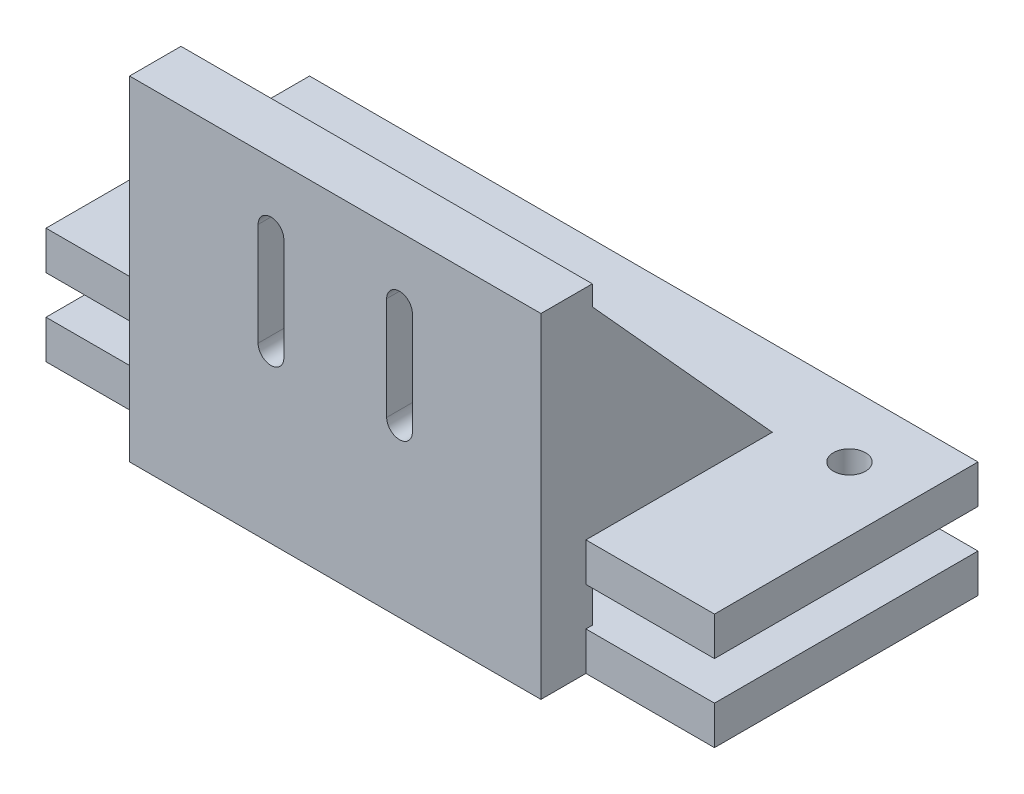
ISO-10303-21;
HEADER;
FILE_DESCRIPTION(('STEP AP214'),'2;1');
FILE_NAME('part.step','',(''),(''),'','','');
FILE_SCHEMA(('AUTOMOTIVE_DESIGN { 1 0 10303 214 1 1 1 1 }'));
ENDSEC;
DATA;
#1=APPLICATION_CONTEXT('core data for automotive mechanical design processes');
#2=APPLICATION_PROTOCOL_DEFINITION('international standard','automotive_design',2000,#1);
#3=PRODUCT_CONTEXT('',#1,'mechanical');
#4=PRODUCT('Part','Part','',(#3));
#5=PRODUCT_RELATED_PRODUCT_CATEGORY('part','',(#4));
#6=PRODUCT_DEFINITION_FORMATION('','',#4);
#7=PRODUCT_DEFINITION_CONTEXT('part definition',#1,'design');
#8=PRODUCT_DEFINITION('design','',#6,#7);
#9=PRODUCT_DEFINITION_SHAPE('','',#8);
#10=(LENGTH_UNIT() NAMED_UNIT(*) SI_UNIT(.MILLI.,.METRE.));
#11=(NAMED_UNIT(*) PLANE_ANGLE_UNIT() SI_UNIT($,.RADIAN.));
#12=(NAMED_UNIT(*) SI_UNIT($,.STERADIAN.) SOLID_ANGLE_UNIT());
#13=UNCERTAINTY_MEASURE_WITH_UNIT(LENGTH_MEASURE(1.E-05),#10,'distance_accuracy_value','');
#14=(GEOMETRIC_REPRESENTATION_CONTEXT(3) GLOBAL_UNCERTAINTY_ASSIGNED_CONTEXT((#13)) GLOBAL_UNIT_ASSIGNED_CONTEXT((#10,
#11,#12)) REPRESENTATION_CONTEXT('',''));
#15=CARTESIAN_POINT('',(0.,0.,0.));
#16=DIRECTION('',(0.,0.,1.));
#17=DIRECTION('',(1.,0.,0.));
#18=AXIS2_PLACEMENT_3D('',#15,#16,#17);
#19=CARTESIAN_POINT('',(0.,0.,0.));
#20=DIRECTION('',(0.,0.,-1.));
#21=DIRECTION('',(-1.,0.,0.));
#22=AXIS2_PLACEMENT_3D('',#19,#20,#21);
#23=PLANE('',#22);
#24=DIRECTION('',(0.,1.,0.));
#25=VECTOR('',#24,1.);
#26=CARTESIAN_POINT('',(32.,-11.5,0.));
#27=LINE('',#26,#25);
#28=CARTESIAN_POINT('',(32.,37.3965517241379,0.));
#29=VERTEX_POINT('',#28);
#30=CARTESIAN_POINT('',(32.,40.5,0.));
#31=VERTEX_POINT('',#30);
#32=EDGE_CURVE('E419',#29,#31,#27,.T.);
#33=ORIENTED_EDGE('',*,*,#32,.F.);
#34=DIRECTION('',(-1.,0.,0.));
#35=VECTOR('',#34,1.);
#36=CARTESIAN_POINT('',(0.,37.3965517241379,0.));
#37=LINE('',#36,#35);
#38=CARTESIAN_POINT('',(26.,37.3965517241379,0.));
#39=VERTEX_POINT('',#38);
#40=EDGE_CURVE('E314',#29,#39,#37,.T.);
#41=ORIENTED_EDGE('',*,*,#40,.T.);
#42=DIRECTION('',(0.,1.,0.));
#43=VECTOR('',#42,1.);
#44=CARTESIAN_POINT('',(26.,0.,0.));
#45=LINE('',#44,#43);
#46=CARTESIAN_POINT('',(26.,6.5,0.));
#47=VERTEX_POINT('',#46);
#48=EDGE_CURVE('E317',#47,#39,#45,.T.);
#49=ORIENTED_EDGE('',*,*,#48,.F.);
#50=DIRECTION('',(-1.,0.,0.));
#51=VECTOR('',#50,1.);
#52=CARTESIAN_POINT('',(0.,6.5,0.));
#53=LINE('',#52,#51);
#54=CARTESIAN_POINT('',(-26.,6.5,0.));
#55=VERTEX_POINT('',#54);
#56=EDGE_CURVE('E456',#47,#55,#53,.T.);
#57=ORIENTED_EDGE('',*,*,#56,.T.);
#58=DIRECTION('',(0.,1.,0.));
#59=VECTOR('',#58,1.);
#60=CARTESIAN_POINT('',(-26.,0.,0.));
#61=LINE('',#60,#59);
#62=CARTESIAN_POINT('',(-26.,37.3965517241379,0.));
#63=VERTEX_POINT('',#62);
#64=EDGE_CURVE('E327',#55,#63,#61,.T.);
#65=ORIENTED_EDGE('',*,*,#64,.T.);
#66=DIRECTION('',(-1.,0.,0.));
#67=VECTOR('',#66,1.);
#68=CARTESIAN_POINT('',(0.,37.3965517241379,0.));
#69=LINE('',#68,#67);
#70=CARTESIAN_POINT('',(-32.,37.3965517241379,0.));
#71=VERTEX_POINT('',#70);
#72=EDGE_CURVE('E330',#63,#71,#69,.T.);
#73=ORIENTED_EDGE('',*,*,#72,.T.);
#74=DIRECTION('',(0.,-1.,0.));
#75=VECTOR('',#74,1.);
#76=CARTESIAN_POINT('',(-32.,-11.5,0.));
#77=LINE('',#76,#75);
#78=CARTESIAN_POINT('',(-32.,40.5,0.));
#79=VERTEX_POINT('',#78);
#80=EDGE_CURVE('E424',#79,#71,#77,.T.);
#81=ORIENTED_EDGE('',*,*,#80,.F.);
#82=DIRECTION('',(-1.,0.,0.));
#83=VECTOR('',#82,1.);
#84=CARTESIAN_POINT('',(-32.,40.5,0.));
#85=LINE('',#84,#83);
#86=EDGE_CURVE('E434',#31,#79,#85,.T.);
#87=ORIENTED_EDGE('',*,*,#86,.F.);
#88=EDGE_LOOP('',(#33,#41,#49,#57,#65,#73,#81,#87));
#89=FACE_BOUND('',#88,.T.);
#90=DIRECTION('',(0.,-1.,0.));
#91=VECTOR('',#90,1.);
#92=CARTESIAN_POINT('',(8.,30.5,0.));
#93=LINE('',#92,#91);
#94=CARTESIAN_POINT('',(8.,30.5,0.));
#95=VERTEX_POINT('',#94);
#96=CARTESIAN_POINT('',(8.,14.5,0.));
#97=VERTEX_POINT('',#96);
#98=EDGE_CURVE('E279',#95,#97,#93,.T.);
#99=ORIENTED_EDGE('',*,*,#98,.T.);
#100=CARTESIAN_POINT('',(10.,14.5,0.));
#101=DIRECTION('',(0.,0.,1.));
#102=DIRECTION('',(1.,0.,0.));
#103=AXIS2_PLACEMENT_3D('',#100,#101,#102);
#104=CIRCLE('',#103,2.);
#105=CARTESIAN_POINT('',(12.,14.5,0.));
#106=VERTEX_POINT('',#105);
#107=EDGE_CURVE('E60',#97,#106,#104,.T.);
#108=ORIENTED_EDGE('',*,*,#107,.T.);
#109=DIRECTION('',(0.,1.,0.));
#110=VECTOR('',#109,1.);
#111=CARTESIAN_POINT('',(12.,14.5,0.));
#112=LINE('',#111,#110);
#113=CARTESIAN_POINT('',(12.,30.5,0.));
#114=VERTEX_POINT('',#113);
#115=EDGE_CURVE('E288',#106,#114,#112,.T.);
#116=ORIENTED_EDGE('',*,*,#115,.T.);
#117=CARTESIAN_POINT('',(10.,30.5,0.));
#118=DIRECTION('',(0.,0.,1.));
#119=DIRECTION('',(1.,0.,0.));
#120=AXIS2_PLACEMENT_3D('',#117,#118,#119);
#121=CIRCLE('',#120,2.);
#122=EDGE_CURVE('E292',#114,#95,#121,.T.);
#123=ORIENTED_EDGE('',*,*,#122,.T.);
#124=EDGE_LOOP('',(#99,#108,#116,#123));
#125=FACE_BOUND('',#124,.T.);
#126=DIRECTION('',(0.,-1.,0.));
#127=VECTOR('',#126,1.);
#128=CARTESIAN_POINT('',(-12.,30.5,0.));
#129=LINE('',#128,#127);
#130=CARTESIAN_POINT('',(-12.,30.5,0.));
#131=VERTEX_POINT('',#130);
#132=CARTESIAN_POINT('',(-12.,14.5,0.));
#133=VERTEX_POINT('',#132);
#134=EDGE_CURVE('E244',#131,#133,#129,.T.);
#135=ORIENTED_EDGE('',*,*,#134,.T.);
#136=CARTESIAN_POINT('',(-10.,14.5,0.));
#137=DIRECTION('',(0.,0.,1.));
#138=DIRECTION('',(1.,0.,0.));
#139=AXIS2_PLACEMENT_3D('',#136,#137,#138);
#140=CIRCLE('',#139,2.);
#141=CARTESIAN_POINT('',(-8.,14.5,0.));
#142=VERTEX_POINT('',#141);
#143=EDGE_CURVE('E52',#133,#142,#140,.T.);
#144=ORIENTED_EDGE('',*,*,#143,.T.);
#145=DIRECTION('',(0.,1.,0.));
#146=VECTOR('',#145,1.);
#147=CARTESIAN_POINT('',(-8.,14.5,0.));
#148=LINE('',#147,#146);
#149=CARTESIAN_POINT('',(-8.,30.5,0.));
#150=VERTEX_POINT('',#149);
#151=EDGE_CURVE('E250',#142,#150,#148,.T.);
#152=ORIENTED_EDGE('',*,*,#151,.T.);
#153=CARTESIAN_POINT('',(-10.,30.5,0.));
#154=DIRECTION('',(0.,0.,1.));
#155=DIRECTION('',(1.,0.,0.));
#156=AXIS2_PLACEMENT_3D('',#153,#154,#155);
#157=CIRCLE('',#156,2.);
#158=EDGE_CURVE('E267',#150,#131,#157,.T.);
#159=ORIENTED_EDGE('',*,*,#158,.T.);
#160=EDGE_LOOP('',(#135,#144,#152,#159));
#161=FACE_BOUND('',#160,.T.);
#162=ADVANCED_FACE('F35',(#89,#125,#161),#23,.T.);
#163=CARTESIAN_POINT('',(0.,0.,8.));
#164=DIRECTION('',(0.,0.,-1.));
#165=DIRECTION('',(-1.,0.,0.));
#166=AXIS2_PLACEMENT_3D('',#163,#164,#165);
#167=PLANE('',#166);
#168=CARTESIAN_POINT('',(10.,14.5,8.));
#169=DIRECTION('',(0.,0.,1.));
#170=DIRECTION('',(1.,0.,0.));
#171=AXIS2_PLACEMENT_3D('',#168,#169,#170);
#172=CIRCLE('',#171,2.);
#173=CARTESIAN_POINT('',(8.,14.5,8.));
#174=VERTEX_POINT('',#173);
#175=CARTESIAN_POINT('',(12.,14.5,8.));
#176=VERTEX_POINT('',#175);
#177=EDGE_CURVE('E276',#174,#176,#172,.T.);
#178=ORIENTED_EDGE('',*,*,#177,.F.);
#179=DIRECTION('',(0.,-1.,0.));
#180=VECTOR('',#179,1.);
#181=CARTESIAN_POINT('',(8.,30.5,8.));
#182=LINE('',#181,#180);
#183=CARTESIAN_POINT('',(8.,30.5,8.));
#184=VERTEX_POINT('',#183);
#185=EDGE_CURVE('E284',#184,#174,#182,.T.);
#186=ORIENTED_EDGE('',*,*,#185,.F.);
#187=CARTESIAN_POINT('',(10.,30.5,8.));
#188=DIRECTION('',(0.,0.,1.));
#189=DIRECTION('',(1.,0.,0.));
#190=AXIS2_PLACEMENT_3D('',#187,#188,#189);
#191=CIRCLE('',#190,2.);
#192=CARTESIAN_POINT('',(12.,30.5,8.));
#193=VERTEX_POINT('',#192);
#194=EDGE_CURVE('E281',#193,#184,#191,.T.);
#195=ORIENTED_EDGE('',*,*,#194,.F.);
#196=DIRECTION('',(0.,1.,0.));
#197=VECTOR('',#196,1.);
#198=CARTESIAN_POINT('',(12.,14.5,8.));
#199=LINE('',#198,#197);
#200=EDGE_CURVE('E278',#176,#193,#199,.T.);
#201=ORIENTED_EDGE('',*,*,#200,.F.);
#202=EDGE_LOOP('',(#178,#186,#195,#201));
#203=FACE_BOUND('',#202,.T.);
#204=DIRECTION('',(0.,1.,0.));
#205=VECTOR('',#204,1.);
#206=CARTESIAN_POINT('',(32.,-11.5,8.));
#207=LINE('',#206,#205);
#208=CARTESIAN_POINT('',(32.,-11.5,8.));
#209=VERTEX_POINT('',#208);
#210=CARTESIAN_POINT('',(32.,40.5,8.));
#211=VERTEX_POINT('',#210);
#212=EDGE_CURVE('E420',#209,#211,#207,.T.);
#213=ORIENTED_EDGE('',*,*,#212,.T.);
#214=DIRECTION('',(-1.,0.,0.));
#215=VECTOR('',#214,1.);
#216=CARTESIAN_POINT('',(-32.,40.5,8.));
#217=LINE('',#216,#215);
#218=CARTESIAN_POINT('',(-32.,40.5,8.));
#219=VERTEX_POINT('',#218);
#220=EDGE_CURVE('E423',#211,#219,#217,.T.);
#221=ORIENTED_EDGE('',*,*,#220,.T.);
#222=DIRECTION('',(0.,-1.,0.));
#223=VECTOR('',#222,1.);
#224=CARTESIAN_POINT('',(-32.,-11.5,8.));
#225=LINE('',#224,#223);
#226=CARTESIAN_POINT('',(-32.,-11.5,8.));
#227=VERTEX_POINT('',#226);
#228=EDGE_CURVE('E426',#219,#227,#225,.T.);
#229=ORIENTED_EDGE('',*,*,#228,.T.);
#230=DIRECTION('',(1.,0.,0.));
#231=VECTOR('',#230,1.);
#232=CARTESIAN_POINT('',(-32.,-11.5,8.));
#233=LINE('',#232,#231);
#234=EDGE_CURVE('E428',#227,#209,#233,.T.);
#235=ORIENTED_EDGE('',*,*,#234,.T.);
#236=EDGE_LOOP('',(#213,#221,#229,#235));
#237=FACE_BOUND('',#236,.T.);
#238=CARTESIAN_POINT('',(-10.,14.5,8.));
#239=DIRECTION('',(0.,0.,1.));
#240=DIRECTION('',(1.,0.,0.));
#241=AXIS2_PLACEMENT_3D('',#238,#239,#240);
#242=CIRCLE('',#241,2.);
#243=CARTESIAN_POINT('',(-12.,14.5,8.));
#244=VERTEX_POINT('',#243);
#245=CARTESIAN_POINT('',(-8.,14.5,8.));
#246=VERTEX_POINT('',#245);
#247=EDGE_CURVE('E235',#244,#246,#242,.T.);
#248=ORIENTED_EDGE('',*,*,#247,.F.);
#249=DIRECTION('',(0.,-1.,0.));
#250=VECTOR('',#249,1.);
#251=CARTESIAN_POINT('',(-12.,30.5,8.));
#252=LINE('',#251,#250);
#253=CARTESIAN_POINT('',(-12.,30.5,8.));
#254=VERTEX_POINT('',#253);
#255=EDGE_CURVE('E259',#254,#244,#252,.T.);
#256=ORIENTED_EDGE('',*,*,#255,.F.);
#257=CARTESIAN_POINT('',(-10.,30.5,8.));
#258=DIRECTION('',(0.,0.,1.));
#259=DIRECTION('',(1.,0.,0.));
#260=AXIS2_PLACEMENT_3D('',#257,#258,#259);
#261=CIRCLE('',#260,2.);
#262=CARTESIAN_POINT('',(-8.,30.5,8.));
#263=VERTEX_POINT('',#262);
#264=EDGE_CURVE('E257',#263,#254,#261,.T.);
#265=ORIENTED_EDGE('',*,*,#264,.F.);
#266=DIRECTION('',(0.,1.,0.));
#267=VECTOR('',#266,1.);
#268=CARTESIAN_POINT('',(-8.,14.5,8.));
#269=LINE('',#268,#267);
#270=EDGE_CURVE('E243',#246,#263,#269,.T.);
#271=ORIENTED_EDGE('',*,*,#270,.F.);
#272=EDGE_LOOP('',(#248,#256,#265,#271));
#273=FACE_BOUND('',#272,.T.);
#274=ADVANCED_FACE('F255',(#203,#237,#273),#167,.F.);
#275=CARTESIAN_POINT('',(-52.,6.5,1.));
#276=DIRECTION('',(0.,-1.,0.));
#277=DIRECTION('',(0.,0.,-1.));
#278=AXIS2_PLACEMENT_3D('',#275,#276,#277);
#279=PLANE('',#278);
#280=CARTESIAN_POINT('',(-42.,6.5,-30.));
#281=DIRECTION('',(0.,1.,0.));
#282=DIRECTION('',(0.,0.,1.));
#283=AXIS2_PLACEMENT_3D('',#280,#281,#282);
#284=CIRCLE('',#283,2.5);
#285=CARTESIAN_POINT('',(-42.,6.5,-27.5));
#286=VERTEX_POINT('',#285);
#287=EDGE_CURVE('E461',#286,#286,#284,.T.);
#288=ORIENTED_EDGE('',*,*,#287,.F.);
#289=EDGE_LOOP('',(#288));
#290=FACE_BOUND('',#289,.T.);
#291=CARTESIAN_POINT('',(42.,6.5,-30.));
#292=DIRECTION('',(0.,1.,0.));
#293=DIRECTION('',(0.,0.,1.));
#294=AXIS2_PLACEMENT_3D('',#291,#292,#293);
#295=CIRCLE('',#294,2.5);
#296=CARTESIAN_POINT('',(42.,6.5,-27.5));
#297=VERTEX_POINT('',#296);
#298=EDGE_CURVE('E472',#297,#297,#295,.T.);
#299=ORIENTED_EDGE('',*,*,#298,.F.);
#300=EDGE_LOOP('',(#299));
#301=FACE_BOUND('',#300,.T.);
#302=DIRECTION('',(-1.,0.,0.));
#303=VECTOR('',#302,1.);
#304=CARTESIAN_POINT('',(32.,6.5,-28.));
#305=LINE('',#304,#303);
#306=CARTESIAN_POINT('',(32.,6.5,-28.));
#307=VERTEX_POINT('',#306);
#308=CARTESIAN_POINT('',(26.,6.5,-28.));
#309=VERTEX_POINT('',#308);
#310=EDGE_CURVE('E306',#307,#309,#305,.T.);
#311=ORIENTED_EDGE('',*,*,#310,.F.);
#312=DIRECTION('',(0.,0.,1.));
#313=VECTOR('',#312,1.);
#314=CARTESIAN_POINT('',(32.,6.5,8.));
#315=LINE('',#314,#313);
#316=CARTESIAN_POINT('',(32.,6.5,1.));
#317=VERTEX_POINT('',#316);
#318=EDGE_CURVE('E373',#307,#317,#315,.T.);
#319=ORIENTED_EDGE('',*,*,#318,.T.);
#320=DIRECTION('',(-1.,0.,0.));
#321=VECTOR('',#320,1.);
#322=CARTESIAN_POINT('',(-52.,6.5,1.));
#323=LINE('',#322,#321);
#324=CARTESIAN_POINT('',(52.,6.5,1.));
#325=VERTEX_POINT('',#324);
#326=EDGE_CURVE('E339',#325,#317,#323,.T.);
#327=ORIENTED_EDGE('',*,*,#326,.F.);
#328=DIRECTION('',(0.,0.,-1.));
#329=VECTOR('',#328,1.);
#330=CARTESIAN_POINT('',(52.,6.5,1.));
#331=LINE('',#330,#329);
#332=CARTESIAN_POINT('',(52.,6.5,-40.));
#333=VERTEX_POINT('',#332);
#334=EDGE_CURVE('E364',#325,#333,#331,.T.);
#335=ORIENTED_EDGE('',*,*,#334,.T.);
#336=DIRECTION('',(-1.,0.,0.));
#337=VECTOR('',#336,1.);
#338=CARTESIAN_POINT('',(-52.,6.5,-40.));
#339=LINE('',#338,#337);
#340=CARTESIAN_POINT('',(-52.,6.5,-40.));
#341=VERTEX_POINT('',#340);
#342=EDGE_CURVE('E351',#333,#341,#339,.T.);
#343=ORIENTED_EDGE('',*,*,#342,.T.);
#344=DIRECTION('',(0.,0.,-1.));
#345=VECTOR('',#344,1.);
#346=CARTESIAN_POINT('',(-52.,6.5,1.));
#347=LINE('',#346,#345);
#348=CARTESIAN_POINT('',(-52.,6.5,1.));
#349=VERTEX_POINT('',#348);
#350=EDGE_CURVE('E361',#349,#341,#347,.T.);
#351=ORIENTED_EDGE('',*,*,#350,.F.);
#352=CARTESIAN_POINT('',(-32.,6.5,1.));
#353=VERTEX_POINT('',#352);
#354=EDGE_CURVE('E337',#353,#349,#323,.T.);
#355=ORIENTED_EDGE('',*,*,#354,.F.);
#356=DIRECTION('',(0.,0.,-1.));
#357=VECTOR('',#356,1.);
#358=CARTESIAN_POINT('',(-32.,6.5,8.));
#359=LINE('',#358,#357);
#360=CARTESIAN_POINT('',(-32.,6.5,-28.));
#361=VERTEX_POINT('',#360);
#362=EDGE_CURVE('E371',#353,#361,#359,.T.);
#363=ORIENTED_EDGE('',*,*,#362,.T.);
#364=DIRECTION('',(-1.,0.,0.));
#365=VECTOR('',#364,1.);
#366=CARTESIAN_POINT('',(-26.,6.5,-28.));
#367=LINE('',#366,#365);
#368=CARTESIAN_POINT('',(-26.,6.5,-28.));
#369=VERTEX_POINT('',#368);
#370=EDGE_CURVE('E323',#369,#361,#367,.T.);
#371=ORIENTED_EDGE('',*,*,#370,.F.);
#372=DIRECTION('',(0.,0.,-1.));
#373=VECTOR('',#372,1.);
#374=CARTESIAN_POINT('',(-26.,6.5,1.));
#375=LINE('',#374,#373);
#376=EDGE_CURVE('E11',#55,#369,#375,.T.);
#377=ORIENTED_EDGE('',*,*,#376,.F.);
#378=ORIENTED_EDGE('',*,*,#56,.F.);
#379=DIRECTION('',(0.,0.,-1.));
#380=VECTOR('',#379,1.);
#381=CARTESIAN_POINT('',(26.,6.5,-28.));
#382=LINE('',#381,#380);
#383=EDGE_CURVE('E307',#47,#309,#382,.T.);
#384=ORIENTED_EDGE('',*,*,#383,.T.);
#385=EDGE_LOOP('',(#311,#319,#327,#335,#343,#351,#355,#363,#371,#377,#378,#384));
#386=FACE_BOUND('',#385,.T.);
#387=ADVANCED_FACE('F520',(#290,#301,#386),#279,.F.);
#388=CARTESIAN_POINT('',(32.,-11.5,8.));
#389=DIRECTION('',(-1.,0.,0.));
#390=DIRECTION('',(0.,0.,1.));
#391=AXIS2_PLACEMENT_3D('',#388,#389,#390);
#392=PLANE('',#391);
#393=ORIENTED_EDGE('',*,*,#318,.F.);
#394=DIRECTION('',(0.,0.740986951435983,0.671519424738859));
#395=VECTOR('',#394,1.);
#396=CARTESIAN_POINT('',(32.,38.5,1.));
#397=LINE('',#396,#395);
#398=EDGE_CURVE('E303',#307,#29,#397,.T.);
#399=ORIENTED_EDGE('',*,*,#398,.T.);
#400=ORIENTED_EDGE('',*,*,#32,.T.);
#401=DIRECTION('',(0.,0.,-1.));
#402=VECTOR('',#401,1.);
#403=CARTESIAN_POINT('',(32.,40.5,8.));
#404=LINE('',#403,#402);
#405=EDGE_CURVE('E447',#211,#31,#404,.T.);
#406=ORIENTED_EDGE('',*,*,#405,.F.);
#407=ORIENTED_EDGE('',*,*,#212,.F.);
#408=DIRECTION('',(0.,0.,-1.));
#409=VECTOR('',#408,1.);
#410=CARTESIAN_POINT('',(32.,-11.5,8.));
#411=LINE('',#410,#409);
#412=CARTESIAN_POINT('',(32.,-11.5,1.));
#413=VERTEX_POINT('',#412);
#414=EDGE_CURVE('E430',#209,#413,#411,.T.);
#415=ORIENTED_EDGE('',*,*,#414,.T.);
#416=DIRECTION('',(0.,-1.,0.));
#417=VECTOR('',#416,1.);
#418=CARTESIAN_POINT('',(32.,-11.5,1.));
#419=LINE('',#418,#417);
#420=CARTESIAN_POINT('',(32.,-5.5,1.));
#421=VERTEX_POINT('',#420);
#422=EDGE_CURVE('E417',#421,#413,#419,.T.);
#423=ORIENTED_EDGE('',*,*,#422,.F.);
#424=DIRECTION('',(0.,0.,1.));
#425=VECTOR('',#424,1.);
#426=CARTESIAN_POINT('',(32.,-5.5,8.));
#427=LINE('',#426,#425);
#428=CARTESIAN_POINT('',(32.,-5.5,0.));
#429=VERTEX_POINT('',#428);
#430=EDGE_CURVE('E413',#429,#421,#427,.T.);
#431=ORIENTED_EDGE('',*,*,#430,.F.);
#432=CARTESIAN_POINT('',(32.,0.499999999999999,0.));
#433=VERTEX_POINT('',#432);
#434=EDGE_CURVE('E431',#429,#433,#27,.T.);
#435=ORIENTED_EDGE('',*,*,#434,.T.);
#436=DIRECTION('',(0.,0.,-1.));
#437=VECTOR('',#436,1.);
#438=CARTESIAN_POINT('',(32.,0.499999999999999,8.));
#439=LINE('',#438,#437);
#440=CARTESIAN_POINT('',(32.,0.5,1.));
#441=VERTEX_POINT('',#440);
#442=EDGE_CURVE('E369',#441,#433,#439,.T.);
#443=ORIENTED_EDGE('',*,*,#442,.F.);
#444=DIRECTION('',(0.,-1.,0.));
#445=VECTOR('',#444,1.);
#446=CARTESIAN_POINT('',(32.,-11.5,1.));
#447=LINE('',#446,#445);
#448=EDGE_CURVE('E375',#317,#441,#447,.T.);
#449=ORIENTED_EDGE('',*,*,#448,.F.);
#450=EDGE_LOOP('',(#393,#399,#400,#406,#407,#415,#423,#431,#435,#443,#449));
#451=FACE_BOUND('',#450,.T.);
#452=ADVANCED_FACE('F37',(#451),#392,.F.);
#453=CARTESIAN_POINT('',(-32.,-11.5,8.));
#454=DIRECTION('',(1.,0.,0.));
#455=DIRECTION('',(0.,0.,-1.));
#456=AXIS2_PLACEMENT_3D('',#453,#454,#455);
#457=PLANE('',#456);
#458=ORIENTED_EDGE('',*,*,#80,.T.);
#459=DIRECTION('',(0.,0.740986951435983,0.671519424738859));
#460=VECTOR('',#459,1.);
#461=CARTESIAN_POINT('',(-32.,38.5,1.));
#462=LINE('',#461,#460);
#463=EDGE_CURVE('E319',#361,#71,#462,.T.);
#464=ORIENTED_EDGE('',*,*,#463,.F.);
#465=ORIENTED_EDGE('',*,*,#362,.F.);
#466=DIRECTION('',(0.,1.,0.));
#467=VECTOR('',#466,1.);
#468=CARTESIAN_POINT('',(-32.,-11.5,1.));
#469=LINE('',#468,#467);
#470=CARTESIAN_POINT('',(-32.,0.5,1.));
#471=VERTEX_POINT('',#470);
#472=EDGE_CURVE('E44',#471,#353,#469,.T.);
#473=ORIENTED_EDGE('',*,*,#472,.F.);
#474=DIRECTION('',(0.,0.,1.));
#475=VECTOR('',#474,1.);
#476=CARTESIAN_POINT('',(-32.,0.499999999999999,8.));
#477=LINE('',#476,#475);
#478=CARTESIAN_POINT('',(-32.,0.5,0.));
#479=VERTEX_POINT('',#478);
#480=EDGE_CURVE('E367',#479,#471,#477,.T.);
#481=ORIENTED_EDGE('',*,*,#480,.F.);
#482=CARTESIAN_POINT('',(-32.,-5.5,0.));
#483=VERTEX_POINT('',#482);
#484=EDGE_CURVE('E436',#479,#483,#77,.T.);
#485=ORIENTED_EDGE('',*,*,#484,.T.);
#486=DIRECTION('',(0.,0.,-1.));
#487=VECTOR('',#486,1.);
#488=CARTESIAN_POINT('',(-32.,-5.5,8.));
#489=LINE('',#488,#487);
#490=CARTESIAN_POINT('',(-32.,-5.5,1.));
#491=VERTEX_POINT('',#490);
#492=EDGE_CURVE('E410',#491,#483,#489,.T.);
#493=ORIENTED_EDGE('',*,*,#492,.F.);
#494=DIRECTION('',(0.,1.,0.));
#495=VECTOR('',#494,1.);
#496=CARTESIAN_POINT('',(-32.,-11.5,1.));
#497=LINE('',#496,#495);
#498=CARTESIAN_POINT('',(-32.,-11.5,1.));
#499=VERTEX_POINT('',#498);
#500=EDGE_CURVE('E415',#499,#491,#497,.T.);
#501=ORIENTED_EDGE('',*,*,#500,.F.);
#502=DIRECTION('',(0.,0.,-1.));
#503=VECTOR('',#502,1.);
#504=CARTESIAN_POINT('',(-32.,-11.5,8.));
#505=LINE('',#504,#503);
#506=EDGE_CURVE('E441',#227,#499,#505,.T.);
#507=ORIENTED_EDGE('',*,*,#506,.F.);
#508=ORIENTED_EDGE('',*,*,#228,.F.);
#509=DIRECTION('',(0.,0.,-1.));
#510=VECTOR('',#509,1.);
#511=CARTESIAN_POINT('',(-32.,40.5,8.));
#512=LINE('',#511,#510);
#513=EDGE_CURVE('E444',#219,#79,#512,.T.);
#514=ORIENTED_EDGE('',*,*,#513,.T.);
#515=EDGE_LOOP('',(#458,#464,#465,#473,#481,#485,#493,#501,#507,#508,#514));
#516=FACE_BOUND('',#515,.T.);
#517=ADVANCED_FACE('F511',(#516),#457,.F.);
#518=ORIENTED_EDGE('',*,*,#484,.F.);
#519=DIRECTION('',(1.,0.,0.));
#520=VECTOR('',#519,1.);
#521=CARTESIAN_POINT('',(0.,0.5,0.));
#522=LINE('',#521,#520);
#523=EDGE_CURVE('E453',#479,#433,#522,.T.);
#524=ORIENTED_EDGE('',*,*,#523,.T.);
#525=ORIENTED_EDGE('',*,*,#434,.F.);
#526=DIRECTION('',(-1.,0.,0.));
#527=VECTOR('',#526,1.);
#528=CARTESIAN_POINT('',(0.,-5.5,0.));
#529=LINE('',#528,#527);
#530=EDGE_CURVE('E450',#429,#483,#529,.T.);
#531=ORIENTED_EDGE('',*,*,#530,.T.);
#532=EDGE_LOOP('',(#518,#524,#525,#531));
#533=FACE_BOUND('',#532,.T.);
#534=ADVANCED_FACE('F506',(#533),#23,.T.);
#535=CARTESIAN_POINT('',(-32.,40.5,8.));
#536=DIRECTION('',(0.,-1.,0.));
#537=DIRECTION('',(0.,0.,-1.));
#538=AXIS2_PLACEMENT_3D('',#535,#536,#537);
#539=PLANE('',#538);
#540=ORIENTED_EDGE('',*,*,#86,.T.);
#541=ORIENTED_EDGE('',*,*,#513,.F.);
#542=ORIENTED_EDGE('',*,*,#220,.F.);
#543=ORIENTED_EDGE('',*,*,#405,.T.);
#544=EDGE_LOOP('',(#540,#541,#542,#543));
#545=FACE_BOUND('',#544,.T.);
#546=ADVANCED_FACE('F547',(#545),#539,.F.);
#547=CARTESIAN_POINT('',(-32.,-11.5,8.));
#548=DIRECTION('',(0.,1.,0.));
#549=DIRECTION('',(0.,0.,1.));
#550=AXIS2_PLACEMENT_3D('',#547,#548,#549);
#551=PLANE('',#550);
#552=CARTESIAN_POINT('',(-42.,-11.5,-30.));
#553=DIRECTION('',(0.,1.,0.));
#554=DIRECTION('',(0.,0.,1.));
#555=AXIS2_PLACEMENT_3D('',#552,#553,#554);
#556=CIRCLE('',#555,2.5);
#557=CARTESIAN_POINT('',(-42.,-11.5,-27.5));
#558=VERTEX_POINT('',#557);
#559=EDGE_CURVE('E467',#558,#558,#556,.T.);
#560=ORIENTED_EDGE('',*,*,#559,.T.);
#561=EDGE_LOOP('',(#560));
#562=FACE_BOUND('',#561,.T.);
#563=CARTESIAN_POINT('',(42.,-11.5,-30.));
#564=DIRECTION('',(0.,1.,0.));
#565=DIRECTION('',(0.,0.,1.));
#566=AXIS2_PLACEMENT_3D('',#563,#564,#565);
#567=CIRCLE('',#566,2.5);
#568=CARTESIAN_POINT('',(42.,-11.5,-27.5));
#569=VERTEX_POINT('',#568);
#570=EDGE_CURVE('E477',#569,#569,#567,.T.);
#571=ORIENTED_EDGE('',*,*,#570,.T.);
#572=EDGE_LOOP('',(#571));
#573=FACE_BOUND('',#572,.T.);
#574=ORIENTED_EDGE('',*,*,#506,.T.);
#575=DIRECTION('',(1.,0.,0.));
#576=VECTOR('',#575,1.);
#577=CARTESIAN_POINT('',(-52.,-11.5,1.));
#578=LINE('',#577,#576);
#579=CARTESIAN_POINT('',(-52.,-11.5,1.));
#580=VERTEX_POINT('',#579);
#581=EDGE_CURVE('E389',#580,#499,#578,.T.);
#582=ORIENTED_EDGE('',*,*,#581,.F.);
#583=DIRECTION('',(0.,0.,-1.));
#584=VECTOR('',#583,1.);
#585=CARTESIAN_POINT('',(-52.,-11.5,1.));
#586=LINE('',#585,#584);
#587=CARTESIAN_POINT('',(-52.,-11.5,-40.));
#588=VERTEX_POINT('',#587);
#589=EDGE_CURVE('E401',#580,#588,#586,.T.);
#590=ORIENTED_EDGE('',*,*,#589,.T.);
#591=DIRECTION('',(1.,0.,0.));
#592=VECTOR('',#591,1.);
#593=CARTESIAN_POINT('',(-52.,-11.5,-40.));
#594=LINE('',#593,#592);
#595=CARTESIAN_POINT('',(52.,-11.5,-40.));
#596=VERTEX_POINT('',#595);
#597=EDGE_CURVE('E382',#588,#596,#594,.T.);
#598=ORIENTED_EDGE('',*,*,#597,.T.);
#599=DIRECTION('',(0.,0.,-1.));
#600=VECTOR('',#599,1.);
#601=CARTESIAN_POINT('',(52.,-11.5,1.));
#602=LINE('',#601,#600);
#603=CARTESIAN_POINT('',(52.,-11.5,1.));
#604=VERTEX_POINT('',#603);
#605=EDGE_CURVE('E391',#604,#596,#602,.T.);
#606=ORIENTED_EDGE('',*,*,#605,.F.);
#607=EDGE_CURVE('E388',#413,#604,#578,.T.);
#608=ORIENTED_EDGE('',*,*,#607,.F.);
#609=ORIENTED_EDGE('',*,*,#414,.F.);
#610=ORIENTED_EDGE('',*,*,#234,.F.);
#611=EDGE_LOOP('',(#574,#582,#590,#598,#606,#608,#609,#610));
#612=FACE_BOUND('',#611,.T.);
#613=ADVANCED_FACE('F556',(#562,#573,#612),#551,.F.);
#614=CARTESIAN_POINT('',(0.,0.,1.));
#615=DIRECTION('',(0.,0.,-1.));
#616=DIRECTION('',(-1.,0.,0.));
#617=AXIS2_PLACEMENT_3D('',#614,#615,#616);
#618=PLANE('',#617);
#619=DIRECTION('',(-1.,0.,0.));
#620=VECTOR('',#619,1.);
#621=CARTESIAN_POINT('',(-52.,-5.5,1.));
#622=LINE('',#621,#620);
#623=CARTESIAN_POINT('',(52.,-5.5,1.));
#624=VERTEX_POINT('',#623);
#625=EDGE_CURVE('E383',#624,#421,#622,.T.);
#626=ORIENTED_EDGE('',*,*,#625,.T.);
#627=ORIENTED_EDGE('',*,*,#422,.T.);
#628=ORIENTED_EDGE('',*,*,#607,.T.);
#629=DIRECTION('',(0.,1.,0.));
#630=VECTOR('',#629,1.);
#631=CARTESIAN_POINT('',(52.,-11.5,1.));
#632=LINE('',#631,#630);
#633=EDGE_CURVE('E378',#604,#624,#632,.T.);
#634=ORIENTED_EDGE('',*,*,#633,.T.);
#635=EDGE_LOOP('',(#626,#627,#628,#634));
#636=FACE_BOUND('',#635,.T.);
#637=ADVANCED_FACE('F559',(#636),#618,.F.);
#638=ORIENTED_EDGE('',*,*,#581,.T.);
#639=ORIENTED_EDGE('',*,*,#500,.T.);
#640=CARTESIAN_POINT('',(-52.,-5.5,1.));
#641=VERTEX_POINT('',#640);
#642=EDGE_CURVE('E381',#491,#641,#622,.T.);
#643=ORIENTED_EDGE('',*,*,#642,.T.);
#644=DIRECTION('',(0.,-1.,0.));
#645=VECTOR('',#644,1.);
#646=CARTESIAN_POINT('',(-52.,-11.5,1.));
#647=LINE('',#646,#645);
#648=EDGE_CURVE('E386',#641,#580,#647,.T.);
#649=ORIENTED_EDGE('',*,*,#648,.T.);
#650=EDGE_LOOP('',(#638,#639,#643,#649));
#651=FACE_BOUND('',#650,.T.);
#652=ADVANCED_FACE('F571',(#651),#618,.F.);
#653=CARTESIAN_POINT('',(-52.,-5.5,1.));
#654=DIRECTION('',(0.,-1.,0.));
#655=DIRECTION('',(0.,0.,-1.));
#656=AXIS2_PLACEMENT_3D('',#653,#654,#655);
#657=PLANE('',#656);
#658=CARTESIAN_POINT('',(-42.,-5.5,-30.));
#659=DIRECTION('',(0.,-1.,0.));
#660=DIRECTION('',(0.,0.,-1.));
#661=AXIS2_PLACEMENT_3D('',#658,#659,#660);
#662=CIRCLE('',#661,2.5);
#663=CARTESIAN_POINT('',(-42.,-5.5,-32.5));
#664=VERTEX_POINT('',#663);
#665=EDGE_CURVE('E289',#664,#664,#662,.F.);
#666=ORIENTED_EDGE('',*,*,#665,.F.);
#667=EDGE_LOOP('',(#666));
#668=FACE_BOUND('',#667,.T.);
#669=CARTESIAN_POINT('',(42.,-5.5,-30.));
#670=DIRECTION('',(0.,-1.,0.));
#671=DIRECTION('',(0.,0.,-1.));
#672=AXIS2_PLACEMENT_3D('',#669,#670,#671);
#673=CIRCLE('',#672,2.5);
#674=CARTESIAN_POINT('',(42.,-5.5,-32.5));
#675=VERTEX_POINT('',#674);
#676=EDGE_CURVE('E460',#675,#675,#673,.F.);
#677=ORIENTED_EDGE('',*,*,#676,.F.);
#678=EDGE_LOOP('',(#677));
#679=FACE_BOUND('',#678,.T.);
#680=ORIENTED_EDGE('',*,*,#530,.F.);
#681=ORIENTED_EDGE('',*,*,#430,.T.);
#682=ORIENTED_EDGE('',*,*,#625,.F.);
#683=DIRECTION('',(0.,0.,-1.));
#684=VECTOR('',#683,1.);
#685=CARTESIAN_POINT('',(52.,-5.5,1.));
#686=LINE('',#685,#684);
#687=CARTESIAN_POINT('',(52.,-5.5,-40.));
#688=VERTEX_POINT('',#687);
#689=EDGE_CURVE('E407',#624,#688,#686,.T.);
#690=ORIENTED_EDGE('',*,*,#689,.T.);
#691=DIRECTION('',(-1.,0.,0.));
#692=VECTOR('',#691,1.);
#693=CARTESIAN_POINT('',(-52.,-5.5,-40.));
#694=LINE('',#693,#692);
#695=CARTESIAN_POINT('',(-52.,-5.5,-40.));
#696=VERTEX_POINT('',#695);
#697=EDGE_CURVE('E394',#688,#696,#694,.T.);
#698=ORIENTED_EDGE('',*,*,#697,.T.);
#699=DIRECTION('',(0.,0.,-1.));
#700=VECTOR('',#699,1.);
#701=CARTESIAN_POINT('',(-52.,-5.5,1.));
#702=LINE('',#701,#700);
#703=EDGE_CURVE('E404',#641,#696,#702,.T.);
#704=ORIENTED_EDGE('',*,*,#703,.F.);
#705=ORIENTED_EDGE('',*,*,#642,.F.);
#706=ORIENTED_EDGE('',*,*,#492,.T.);
#707=EDGE_LOOP('',(#680,#681,#682,#690,#698,#704,#705,#706));
#708=FACE_BOUND('',#707,.T.);
#709=ADVANCED_FACE('F563',(#668,#679,#708),#657,.F.);
#710=CARTESIAN_POINT('',(52.,-11.5,1.));
#711=DIRECTION('',(-1.,0.,0.));
#712=DIRECTION('',(0.,0.,1.));
#713=AXIS2_PLACEMENT_3D('',#710,#711,#712);
#714=PLANE('',#713);
#715=DIRECTION('',(0.,1.,0.));
#716=VECTOR('',#715,1.);
#717=CARTESIAN_POINT('',(52.,-11.5,-40.));
#718=LINE('',#717,#716);
#719=EDGE_CURVE('E377',#596,#688,#718,.T.);
#720=ORIENTED_EDGE('',*,*,#719,.T.);
#721=ORIENTED_EDGE('',*,*,#689,.F.);
#722=ORIENTED_EDGE('',*,*,#633,.F.);
#723=ORIENTED_EDGE('',*,*,#605,.T.);
#724=EDGE_LOOP('',(#720,#721,#722,#723));
#725=FACE_BOUND('',#724,.T.);
#726=ADVANCED_FACE('F580',(#725),#714,.F.);
#727=CARTESIAN_POINT('',(-52.,-11.5,1.));
#728=DIRECTION('',(1.,0.,0.));
#729=DIRECTION('',(0.,0.,-1.));
#730=AXIS2_PLACEMENT_3D('',#727,#728,#729);
#731=PLANE('',#730);
#732=DIRECTION('',(0.,-1.,0.));
#733=VECTOR('',#732,1.);
#734=CARTESIAN_POINT('',(-52.,-11.5,-40.));
#735=LINE('',#734,#733);
#736=EDGE_CURVE('E396',#696,#588,#735,.T.);
#737=ORIENTED_EDGE('',*,*,#736,.T.);
#738=ORIENTED_EDGE('',*,*,#589,.F.);
#739=ORIENTED_EDGE('',*,*,#648,.F.);
#740=ORIENTED_EDGE('',*,*,#703,.T.);
#741=EDGE_LOOP('',(#737,#738,#739,#740));
#742=FACE_BOUND('',#741,.T.);
#743=ADVANCED_FACE('F574',(#742),#731,.F.);
#744=CARTESIAN_POINT('',(0.,0.,-40.));
#745=DIRECTION('',(0.,0.,-1.));
#746=DIRECTION('',(-1.,0.,0.));
#747=AXIS2_PLACEMENT_3D('',#744,#745,#746);
#748=PLANE('',#747);
#749=ORIENTED_EDGE('',*,*,#719,.F.);
#750=ORIENTED_EDGE('',*,*,#597,.F.);
#751=ORIENTED_EDGE('',*,*,#736,.F.);
#752=ORIENTED_EDGE('',*,*,#697,.F.);
#753=EDGE_LOOP('',(#749,#750,#751,#752));
#754=FACE_BOUND('',#753,.T.);
#755=ADVANCED_FACE('F578',(#754),#748,.T.);
#756=CARTESIAN_POINT('',(0.,0.,1.));
#757=DIRECTION('',(0.,0.,-1.));
#758=DIRECTION('',(-1.,0.,0.));
#759=AXIS2_PLACEMENT_3D('',#756,#757,#758);
#760=PLANE('',#759);
#761=ORIENTED_EDGE('',*,*,#326,.T.);
#762=ORIENTED_EDGE('',*,*,#448,.T.);
#763=DIRECTION('',(1.,0.,0.));
#764=VECTOR('',#763,1.);
#765=CARTESIAN_POINT('',(-52.,0.5,1.));
#766=LINE('',#765,#764);
#767=CARTESIAN_POINT('',(52.,0.5,1.));
#768=VERTEX_POINT('',#767);
#769=EDGE_CURVE('E344',#441,#768,#766,.T.);
#770=ORIENTED_EDGE('',*,*,#769,.T.);
#771=DIRECTION('',(0.,1.,0.));
#772=VECTOR('',#771,1.);
#773=CARTESIAN_POINT('',(52.,0.5,1.));
#774=LINE('',#773,#772);
#775=EDGE_CURVE('E334',#768,#325,#774,.T.);
#776=ORIENTED_EDGE('',*,*,#775,.T.);
#777=EDGE_LOOP('',(#761,#762,#770,#776));
#778=FACE_BOUND('',#777,.T.);
#779=ADVANCED_FACE('F533',(#778),#760,.F.);
#780=CARTESIAN_POINT('',(-52.,0.5,1.));
#781=VERTEX_POINT('',#780);
#782=EDGE_CURVE('E345',#781,#471,#766,.T.);
#783=ORIENTED_EDGE('',*,*,#782,.T.);
#784=ORIENTED_EDGE('',*,*,#472,.T.);
#785=ORIENTED_EDGE('',*,*,#354,.T.);
#786=DIRECTION('',(0.,-1.,0.));
#787=VECTOR('',#786,1.);
#788=CARTESIAN_POINT('',(-52.,0.5,1.));
#789=LINE('',#788,#787);
#790=EDGE_CURVE('E342',#349,#781,#789,.T.);
#791=ORIENTED_EDGE('',*,*,#790,.T.);
#792=EDGE_LOOP('',(#783,#784,#785,#791));
#793=FACE_BOUND('',#792,.T.);
#794=ADVANCED_FACE('F491',(#793),#760,.F.);
#795=CARTESIAN_POINT('',(-52.,0.5,1.));
#796=DIRECTION('',(0.,1.,0.));
#797=DIRECTION('',(0.,0.,1.));
#798=AXIS2_PLACEMENT_3D('',#795,#796,#797);
#799=PLANE('',#798);
#800=CARTESIAN_POINT('',(-42.,0.5,-30.));
#801=DIRECTION('',(0.,1.,0.));
#802=DIRECTION('',(0.,0.,1.));
#803=AXIS2_PLACEMENT_3D('',#800,#801,#802);
#804=CIRCLE('',#803,2.5);
#805=CARTESIAN_POINT('',(-42.,0.5,-27.5));
#806=VERTEX_POINT('',#805);
#807=EDGE_CURVE('E39',#806,#806,#804,.F.);
#808=ORIENTED_EDGE('',*,*,#807,.F.);
#809=EDGE_LOOP('',(#808));
#810=FACE_BOUND('',#809,.T.);
#811=CARTESIAN_POINT('',(42.,0.5,-30.));
#812=DIRECTION('',(0.,1.,0.));
#813=DIRECTION('',(0.,0.,1.));
#814=AXIS2_PLACEMENT_3D('',#811,#812,#813);
#815=CIRCLE('',#814,2.5);
#816=CARTESIAN_POINT('',(42.,0.5,-27.5));
#817=VERTEX_POINT('',#816);
#818=EDGE_CURVE('E458',#817,#817,#815,.F.);
#819=ORIENTED_EDGE('',*,*,#818,.F.);
#820=EDGE_LOOP('',(#819));
#821=FACE_BOUND('',#820,.T.);
#822=ORIENTED_EDGE('',*,*,#769,.F.);
#823=ORIENTED_EDGE('',*,*,#442,.T.);
#824=ORIENTED_EDGE('',*,*,#523,.F.);
#825=ORIENTED_EDGE('',*,*,#480,.T.);
#826=ORIENTED_EDGE('',*,*,#782,.F.);
#827=DIRECTION('',(0.,0.,-1.));
#828=VECTOR('',#827,1.);
#829=CARTESIAN_POINT('',(-52.,0.5,1.));
#830=LINE('',#829,#828);
#831=CARTESIAN_POINT('',(-52.,0.5,-40.));
#832=VERTEX_POINT('',#831);
#833=EDGE_CURVE('E358',#781,#832,#830,.T.);
#834=ORIENTED_EDGE('',*,*,#833,.T.);
#835=DIRECTION('',(1.,0.,0.));
#836=VECTOR('',#835,1.);
#837=CARTESIAN_POINT('',(-52.,0.5,-40.));
#838=LINE('',#837,#836);
#839=CARTESIAN_POINT('',(52.,0.5,-40.));
#840=VERTEX_POINT('',#839);
#841=EDGE_CURVE('E338',#832,#840,#838,.T.);
#842=ORIENTED_EDGE('',*,*,#841,.T.);
#843=DIRECTION('',(0.,0.,-1.));
#844=VECTOR('',#843,1.);
#845=CARTESIAN_POINT('',(52.,0.5,1.));
#846=LINE('',#845,#844);
#847=EDGE_CURVE('E348',#768,#840,#846,.T.);
#848=ORIENTED_EDGE('',*,*,#847,.F.);
#849=EDGE_LOOP('',(#822,#823,#824,#825,#826,#834,#842,#848));
#850=FACE_BOUND('',#849,.T.);
#851=ADVANCED_FACE('F487',(#810,#821,#850),#799,.F.);
#852=CARTESIAN_POINT('',(52.,0.5,1.));
#853=DIRECTION('',(-1.,0.,0.));
#854=DIRECTION('',(0.,0.,1.));
#855=AXIS2_PLACEMENT_3D('',#852,#853,#854);
#856=PLANE('',#855);
#857=DIRECTION('',(0.,1.,0.));
#858=VECTOR('',#857,1.);
#859=CARTESIAN_POINT('',(52.,0.5,-40.));
#860=LINE('',#859,#858);
#861=EDGE_CURVE('E333',#840,#333,#860,.T.);
#862=ORIENTED_EDGE('',*,*,#861,.T.);
#863=ORIENTED_EDGE('',*,*,#334,.F.);
#864=ORIENTED_EDGE('',*,*,#775,.F.);
#865=ORIENTED_EDGE('',*,*,#847,.T.);
#866=EDGE_LOOP('',(#862,#863,#864,#865));
#867=FACE_BOUND('',#866,.T.);
#868=ADVANCED_FACE('F490',(#867),#856,.F.);
#869=CARTESIAN_POINT('',(-52.,0.5,1.));
#870=DIRECTION('',(1.,0.,0.));
#871=DIRECTION('',(0.,0.,-1.));
#872=AXIS2_PLACEMENT_3D('',#869,#870,#871);
#873=PLANE('',#872);
#874=DIRECTION('',(0.,-1.,0.));
#875=VECTOR('',#874,1.);
#876=CARTESIAN_POINT('',(-52.,0.5,-40.));
#877=LINE('',#876,#875);
#878=EDGE_CURVE('E353',#341,#832,#877,.T.);
#879=ORIENTED_EDGE('',*,*,#878,.T.);
#880=ORIENTED_EDGE('',*,*,#833,.F.);
#881=ORIENTED_EDGE('',*,*,#790,.F.);
#882=ORIENTED_EDGE('',*,*,#350,.T.);
#883=EDGE_LOOP('',(#879,#880,#881,#882));
#884=FACE_BOUND('',#883,.T.);
#885=ADVANCED_FACE('F526',(#884),#873,.F.);
#886=CARTESIAN_POINT('',(0.,0.,-40.));
#887=DIRECTION('',(0.,0.,-1.));
#888=DIRECTION('',(-1.,0.,0.));
#889=AXIS2_PLACEMENT_3D('',#886,#887,#888);
#890=PLANE('',#889);
#891=ORIENTED_EDGE('',*,*,#861,.F.);
#892=ORIENTED_EDGE('',*,*,#841,.F.);
#893=ORIENTED_EDGE('',*,*,#878,.F.);
#894=ORIENTED_EDGE('',*,*,#342,.F.);
#895=EDGE_LOOP('',(#891,#892,#893,#894));
#896=FACE_BOUND('',#895,.T.);
#897=ADVANCED_FACE('F530',(#896),#890,.T.);
#898=CARTESIAN_POINT('',(-26.,38.5,1.));
#899=DIRECTION('',(0.,-0.671519424738859,0.740986951435983));
#900=DIRECTION('',(0.,-0.740986951435983,-0.671519424738859));
#901=AXIS2_PLACEMENT_3D('',#898,#899,#900);
#902=PLANE('',#901);
#903=ORIENTED_EDGE('',*,*,#72,.F.);
#904=DIRECTION('',(0.,0.740986951435983,0.671519424738859));
#905=VECTOR('',#904,1.);
#906=CARTESIAN_POINT('',(-26.,38.5,1.));
#907=LINE('',#906,#905);
#908=EDGE_CURVE('E320',#369,#63,#907,.T.);
#909=ORIENTED_EDGE('',*,*,#908,.F.);
#910=ORIENTED_EDGE('',*,*,#370,.T.);
#911=ORIENTED_EDGE('',*,*,#463,.T.);
#912=EDGE_LOOP('',(#903,#909,#910,#911));
#913=FACE_BOUND('',#912,.T.);
#914=ADVANCED_FACE('F661',(#913),#902,.F.);
#915=CARTESIAN_POINT('',(-26.,0.,0.));
#916=DIRECTION('',(-1.,0.,0.));
#917=DIRECTION('',(0.,0.,1.));
#918=AXIS2_PLACEMENT_3D('',#915,#916,#917);
#919=PLANE('',#918);
#920=ORIENTED_EDGE('',*,*,#64,.F.);
#921=ORIENTED_EDGE('',*,*,#376,.T.);
#922=ORIENTED_EDGE('',*,*,#908,.T.);
#923=EDGE_LOOP('',(#920,#921,#922));
#924=FACE_BOUND('',#923,.T.);
#925=ADVANCED_FACE('F668',(#924),#919,.F.);
#926=CARTESIAN_POINT('',(32.,38.5,1.));
#927=DIRECTION('',(0.,-0.671519424738859,0.740986951435983));
#928=DIRECTION('',(0.,-0.740986951435983,-0.671519424738859));
#929=AXIS2_PLACEMENT_3D('',#926,#927,#928);
#930=PLANE('',#929);
#931=ORIENTED_EDGE('',*,*,#40,.F.);
#932=ORIENTED_EDGE('',*,*,#398,.F.);
#933=ORIENTED_EDGE('',*,*,#310,.T.);
#934=DIRECTION('',(0.,0.740986951435983,0.671519424738859));
#935=VECTOR('',#934,1.);
#936=CARTESIAN_POINT('',(26.,38.5,1.));
#937=LINE('',#936,#935);
#938=EDGE_CURVE('E251',#309,#39,#937,.T.);
#939=ORIENTED_EDGE('',*,*,#938,.T.);
#940=EDGE_LOOP('',(#931,#932,#933,#939));
#941=FACE_BOUND('',#940,.T.);
#942=ADVANCED_FACE('F537',(#941),#930,.F.);
#943=CARTESIAN_POINT('',(26.,0.,0.));
#944=DIRECTION('',(-1.,0.,0.));
#945=DIRECTION('',(0.,0.,1.));
#946=AXIS2_PLACEMENT_3D('',#943,#944,#945);
#947=PLANE('',#946);
#948=ORIENTED_EDGE('',*,*,#383,.F.);
#949=ORIENTED_EDGE('',*,*,#48,.T.);
#950=ORIENTED_EDGE('',*,*,#938,.F.);
#951=EDGE_LOOP('',(#948,#949,#950));
#952=FACE_BOUND('',#951,.T.);
#953=ADVANCED_FACE('F818',(#952),#947,.T.);
#954=CARTESIAN_POINT('',(10.,14.5,8.));
#955=DIRECTION('',(0.,0.,-1.));
#956=DIRECTION('',(-1.,0.,0.));
#957=AXIS2_PLACEMENT_3D('',#954,#955,#956);
#958=CYLINDRICAL_SURFACE('',#957,2.);
#959=ORIENTED_EDGE('',*,*,#107,.F.);
#960=DIRECTION('',(0.,0.,-1.));
#961=VECTOR('',#960,1.);
#962=CARTESIAN_POINT('',(8.,14.5,8.));
#963=LINE('',#962,#961);
#964=EDGE_CURVE('E286',#174,#97,#963,.T.);
#965=ORIENTED_EDGE('',*,*,#964,.F.);
#966=ORIENTED_EDGE('',*,*,#177,.T.);
#967=DIRECTION('',(0.,0.,-1.));
#968=VECTOR('',#967,1.);
#969=CARTESIAN_POINT('',(12.,14.5,8.));
#970=LINE('',#969,#968);
#971=EDGE_CURVE('E265',#176,#106,#970,.T.);
#972=ORIENTED_EDGE('',*,*,#971,.T.);
#973=EDGE_LOOP('',(#959,#965,#966,#972));
#974=FACE_BOUND('',#973,.T.);
#975=ADVANCED_FACE('F808',(#974),#958,.F.);
#976=CARTESIAN_POINT('',(12.,14.5,8.));
#977=DIRECTION('',(-1.,0.,0.));
#978=DIRECTION('',(0.,0.,1.));
#979=AXIS2_PLACEMENT_3D('',#976,#977,#978);
#980=PLANE('',#979);
#981=ORIENTED_EDGE('',*,*,#115,.F.);
#982=ORIENTED_EDGE('',*,*,#971,.F.);
#983=ORIENTED_EDGE('',*,*,#200,.T.);
#984=DIRECTION('',(0.,0.,-1.));
#985=VECTOR('',#984,1.);
#986=CARTESIAN_POINT('',(12.,30.5,8.));
#987=LINE('',#986,#985);
#988=EDGE_CURVE('E300',#193,#114,#987,.T.);
#989=ORIENTED_EDGE('',*,*,#988,.T.);
#990=EDGE_LOOP('',(#981,#982,#983,#989));
#991=FACE_BOUND('',#990,.T.);
#992=ADVANCED_FACE('F798',(#991),#980,.T.);
#993=CARTESIAN_POINT('',(10.,30.5,8.));
#994=DIRECTION('',(0.,0.,-1.));
#995=DIRECTION('',(-1.,0.,0.));
#996=AXIS2_PLACEMENT_3D('',#993,#994,#995);
#997=CYLINDRICAL_SURFACE('',#996,2.);
#998=ORIENTED_EDGE('',*,*,#122,.F.);
#999=ORIENTED_EDGE('',*,*,#988,.F.);
#1000=ORIENTED_EDGE('',*,*,#194,.T.);
#1001=DIRECTION('',(0.,0.,-1.));
#1002=VECTOR('',#1001,1.);
#1003=CARTESIAN_POINT('',(8.,30.5,8.));
#1004=LINE('',#1003,#1002);
#1005=EDGE_CURVE('E298',#184,#95,#1004,.T.);
#1006=ORIENTED_EDGE('',*,*,#1005,.T.);
#1007=EDGE_LOOP('',(#998,#999,#1000,#1006));
#1008=FACE_BOUND('',#1007,.T.);
#1009=ADVANCED_FACE('F788',(#1008),#997,.F.);
#1010=CARTESIAN_POINT('',(8.,30.5,8.));
#1011=DIRECTION('',(1.,0.,0.));
#1012=DIRECTION('',(0.,0.,-1.));
#1013=AXIS2_PLACEMENT_3D('',#1010,#1011,#1012);
#1014=PLANE('',#1013);
#1015=ORIENTED_EDGE('',*,*,#98,.F.);
#1016=ORIENTED_EDGE('',*,*,#1005,.F.);
#1017=ORIENTED_EDGE('',*,*,#185,.T.);
#1018=ORIENTED_EDGE('',*,*,#964,.T.);
#1019=EDGE_LOOP('',(#1015,#1016,#1017,#1018));
#1020=FACE_BOUND('',#1019,.T.);
#1021=ADVANCED_FACE('F779',(#1020),#1014,.T.);
#1022=CARTESIAN_POINT('',(-10.,14.5,8.));
#1023=DIRECTION('',(0.,0.,-1.));
#1024=DIRECTION('',(-1.,0.,0.));
#1025=AXIS2_PLACEMENT_3D('',#1022,#1023,#1024);
#1026=CYLINDRICAL_SURFACE('',#1025,2.);
#1027=ORIENTED_EDGE('',*,*,#143,.F.);
#1028=DIRECTION('',(0.,0.,-1.));
#1029=VECTOR('',#1028,1.);
#1030=CARTESIAN_POINT('',(-12.,14.5,8.));
#1031=LINE('',#1030,#1029);
#1032=EDGE_CURVE('E239',#244,#133,#1031,.T.);
#1033=ORIENTED_EDGE('',*,*,#1032,.F.);
#1034=ORIENTED_EDGE('',*,*,#247,.T.);
#1035=DIRECTION('',(0.,0.,-1.));
#1036=VECTOR('',#1035,1.);
#1037=CARTESIAN_POINT('',(-8.,14.5,8.));
#1038=LINE('',#1037,#1036);
#1039=EDGE_CURVE('E238',#246,#142,#1038,.T.);
#1040=ORIENTED_EDGE('',*,*,#1039,.T.);
#1041=EDGE_LOOP('',(#1027,#1033,#1034,#1040));
#1042=FACE_BOUND('',#1041,.T.);
#1043=ADVANCED_FACE('F237',(#1042),#1026,.F.);
#1044=CARTESIAN_POINT('',(-8.,14.5,8.));
#1045=DIRECTION('',(-1.,0.,0.));
#1046=DIRECTION('',(0.,0.,1.));
#1047=AXIS2_PLACEMENT_3D('',#1044,#1045,#1046);
#1048=PLANE('',#1047);
#1049=ORIENTED_EDGE('',*,*,#151,.F.);
#1050=ORIENTED_EDGE('',*,*,#1039,.F.);
#1051=ORIENTED_EDGE('',*,*,#270,.T.);
#1052=DIRECTION('',(0.,0.,-1.));
#1053=VECTOR('',#1052,1.);
#1054=CARTESIAN_POINT('',(-8.,30.5,8.));
#1055=LINE('',#1054,#1053);
#1056=EDGE_CURVE('E252',#263,#150,#1055,.T.);
#1057=ORIENTED_EDGE('',*,*,#1056,.T.);
#1058=EDGE_LOOP('',(#1049,#1050,#1051,#1057));
#1059=FACE_BOUND('',#1058,.T.);
#1060=ADVANCED_FACE('F247',(#1059),#1048,.T.);
#1061=CARTESIAN_POINT('',(-10.,30.5,8.));
#1062=DIRECTION('',(0.,0.,-1.));
#1063=DIRECTION('',(-1.,0.,0.));
#1064=AXIS2_PLACEMENT_3D('',#1061,#1062,#1063);
#1065=CYLINDRICAL_SURFACE('',#1064,2.);
#1066=ORIENTED_EDGE('',*,*,#158,.F.);
#1067=ORIENTED_EDGE('',*,*,#1056,.F.);
#1068=ORIENTED_EDGE('',*,*,#264,.T.);
#1069=DIRECTION('',(0.,0.,-1.));
#1070=VECTOR('',#1069,1.);
#1071=CARTESIAN_POINT('',(-12.,30.5,8.));
#1072=LINE('',#1071,#1070);
#1073=EDGE_CURVE('E273',#254,#131,#1072,.T.);
#1074=ORIENTED_EDGE('',*,*,#1073,.T.);
#1075=EDGE_LOOP('',(#1066,#1067,#1068,#1074));
#1076=FACE_BOUND('',#1075,.T.);
#1077=ADVANCED_FACE('F638',(#1076),#1065,.F.);
#1078=CARTESIAN_POINT('',(-12.,30.5,8.));
#1079=DIRECTION('',(1.,0.,0.));
#1080=DIRECTION('',(0.,0.,-1.));
#1081=AXIS2_PLACEMENT_3D('',#1078,#1079,#1080);
#1082=PLANE('',#1081);
#1083=ORIENTED_EDGE('',*,*,#134,.F.);
#1084=ORIENTED_EDGE('',*,*,#1073,.F.);
#1085=ORIENTED_EDGE('',*,*,#255,.T.);
#1086=ORIENTED_EDGE('',*,*,#1032,.T.);
#1087=EDGE_LOOP('',(#1083,#1084,#1085,#1086));
#1088=FACE_BOUND('',#1087,.T.);
#1089=ADVANCED_FACE('F633',(#1088),#1082,.T.);
#1090=CARTESIAN_POINT('',(42.,6.5,-30.));
#1091=DIRECTION('',(0.,-1.,0.));
#1092=DIRECTION('',(0.,0.,-1.));
#1093=AXIS2_PLACEMENT_3D('',#1090,#1091,#1092);
#1094=CYLINDRICAL_SURFACE('',#1093,2.5);
#1095=ORIENTED_EDGE('',*,*,#298,.T.);
#1096=EDGE_LOOP('',(#1095));
#1097=FACE_BOUND('',#1096,.T.);
#1098=ORIENTED_EDGE('',*,*,#818,.T.);
#1099=EDGE_LOOP('',(#1098));
#1100=FACE_BOUND('',#1099,.T.);
#1101=ADVANCED_FACE('F622',(#1097,#1100),#1094,.F.);
#1102=CARTESIAN_POINT('',(-42.,6.5,-30.));
#1103=DIRECTION('',(0.,-1.,0.));
#1104=DIRECTION('',(0.,0.,-1.));
#1105=AXIS2_PLACEMENT_3D('',#1102,#1103,#1104);
#1106=CYLINDRICAL_SURFACE('',#1105,2.5);
#1107=ORIENTED_EDGE('',*,*,#287,.T.);
#1108=EDGE_LOOP('',(#1107));
#1109=FACE_BOUND('',#1108,.T.);
#1110=ORIENTED_EDGE('',*,*,#807,.T.);
#1111=EDGE_LOOP('',(#1110));
#1112=FACE_BOUND('',#1111,.T.);
#1113=ADVANCED_FACE('F485',(#1109,#1112),#1106,.F.);
#1114=ORIENTED_EDGE('',*,*,#570,.F.);
#1115=EDGE_LOOP('',(#1114));
#1116=FACE_BOUND('',#1115,.T.);
#1117=ORIENTED_EDGE('',*,*,#676,.T.);
#1118=EDGE_LOOP('',(#1117));
#1119=FACE_BOUND('',#1118,.T.);
#1120=ADVANCED_FACE('F617',(#1116,#1119),#1094,.F.);
#1121=ORIENTED_EDGE('',*,*,#559,.F.);
#1122=EDGE_LOOP('',(#1121));
#1123=FACE_BOUND('',#1122,.T.);
#1124=ORIENTED_EDGE('',*,*,#665,.T.);
#1125=EDGE_LOOP('',(#1124));
#1126=FACE_BOUND('',#1125,.T.);
#1127=ADVANCED_FACE('F620',(#1123,#1126),#1106,.F.);
#1128=CLOSED_SHELL('',(#162,#274,#387,#452,#517,#534,#546,#613,#637,#652,#709,#726,#743,#755,
#779,#794,#851,#868,#885,#897,#914,#925,#942,#953,#975,#992,#1009,#1021,#1043,#1060,#1077,#1089,
#1101,#1113,#1120,#1127));
#1129=MANIFOLD_SOLID_BREP('B2',#1128);
#1130=ADVANCED_BREP_SHAPE_REPRESENTATION('',(#18,#1129),#14);
#1131=SHAPE_DEFINITION_REPRESENTATION(#9,#1130);
ENDSEC;
END-ISO-10303-21;
